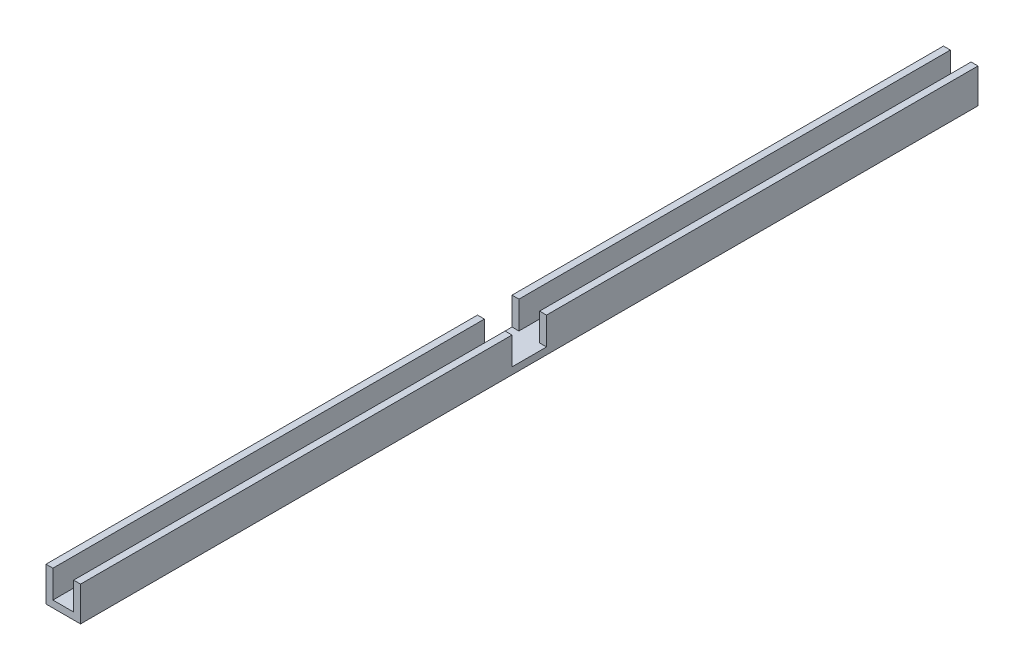
ISO-10303-21;
HEADER;
FILE_DESCRIPTION(('STEP AP214'),'2;1');
FILE_NAME('part.step','',(''),(''),'','','');
FILE_SCHEMA(('AUTOMOTIVE_DESIGN { 1 0 10303 214 1 1 1 1 }'));
ENDSEC;
DATA;
#1=APPLICATION_CONTEXT('core data for automotive mechanical design processes');
#2=APPLICATION_PROTOCOL_DEFINITION('international standard','automotive_design',2000,#1);
#3=PRODUCT_CONTEXT('',#1,'mechanical');
#4=PRODUCT('Part','Part','',(#3));
#5=PRODUCT_RELATED_PRODUCT_CATEGORY('part','',(#4));
#6=PRODUCT_DEFINITION_FORMATION('','',#4);
#7=PRODUCT_DEFINITION_CONTEXT('part definition',#1,'design');
#8=PRODUCT_DEFINITION('design','',#6,#7);
#9=PRODUCT_DEFINITION_SHAPE('','',#8);
#10=(LENGTH_UNIT() NAMED_UNIT(*) SI_UNIT(.MILLI.,.METRE.));
#11=(NAMED_UNIT(*) PLANE_ANGLE_UNIT() SI_UNIT($,.RADIAN.));
#12=(NAMED_UNIT(*) SI_UNIT($,.STERADIAN.) SOLID_ANGLE_UNIT());
#13=UNCERTAINTY_MEASURE_WITH_UNIT(LENGTH_MEASURE(1.E-05),#10,'distance_accuracy_value','');
#14=(GEOMETRIC_REPRESENTATION_CONTEXT(3) GLOBAL_UNCERTAINTY_ASSIGNED_CONTEXT((#13)) GLOBAL_UNIT_ASSIGNED_CONTEXT((#10,
#11,#12)) REPRESENTATION_CONTEXT('',''));
#15=CARTESIAN_POINT('',(0.,0.,0.));
#16=DIRECTION('',(0.,0.,1.));
#17=DIRECTION('',(1.,0.,0.));
#18=AXIS2_PLACEMENT_3D('',#15,#16,#17);
#19=CARTESIAN_POINT('',(2.,0.,260.));
#20=DIRECTION('',(0.,-1.,0.));
#21=DIRECTION('',(1.,0.,0.));
#22=AXIS2_PLACEMENT_3D('',#19,#20,#21);
#23=PLANE('',#22);
#24=DIRECTION('',(0.,0.,-1.));
#25=VECTOR('',#24,1.);
#26=CARTESIAN_POINT('',(0.,0.,260.));
#27=LINE('',#26,#25);
#28=CARTESIAN_POINT('',(0.,0.,125.));
#29=VERTEX_POINT('',#28);
#30=CARTESIAN_POINT('',(0.,0.,0.));
#31=VERTEX_POINT('',#30);
#32=EDGE_CURVE('E169',#29,#31,#27,.T.);
#33=ORIENTED_EDGE('',*,*,#32,.F.);
#34=DIRECTION('',(-1.,0.,0.));
#35=VECTOR('',#34,1.);
#36=CARTESIAN_POINT('',(-8.99622604747202,0.,125.));
#37=LINE('',#36,#35);
#38=CARTESIAN_POINT('',(2.,0.,125.));
#39=VERTEX_POINT('',#38);
#40=EDGE_CURVE('E162',#39,#29,#37,.T.);
#41=ORIENTED_EDGE('',*,*,#40,.F.);
#42=DIRECTION('',(0.,0.,-1.));
#43=VECTOR('',#42,1.);
#44=CARTESIAN_POINT('',(2.,0.,260.));
#45=LINE('',#44,#43);
#46=CARTESIAN_POINT('',(2.,0.,0.));
#47=VERTEX_POINT('',#46);
#48=EDGE_CURVE('E195',#39,#47,#45,.T.);
#49=ORIENTED_EDGE('',*,*,#48,.T.);
#50=DIRECTION('',(-1.,0.,0.));
#51=VECTOR('',#50,1.);
#52=CARTESIAN_POINT('',(2.,0.,0.));
#53=LINE('',#52,#51);
#54=EDGE_CURVE('E216',#47,#31,#53,.T.);
#55=ORIENTED_EDGE('',*,*,#54,.T.);
#56=EDGE_LOOP('',(#33,#41,#49,#55));
#57=FACE_BOUND('',#56,.T.);
#58=ADVANCED_FACE('F32',(#57),#23,.F.);
#59=CARTESIAN_POINT('',(10.,0.,260.));
#60=DIRECTION('',(0.,-1.,0.));
#61=DIRECTION('',(1.,0.,0.));
#62=AXIS2_PLACEMENT_3D('',#59,#60,#61);
#63=PLANE('',#62);
#64=DIRECTION('',(0.,0.,-1.));
#65=VECTOR('',#64,1.);
#66=CARTESIAN_POINT('',(8.,0.,260.));
#67=LINE('',#66,#65);
#68=CARTESIAN_POINT('',(8.,0.,125.));
#69=VERTEX_POINT('',#68);
#70=CARTESIAN_POINT('',(8.,0.,0.));
#71=VERTEX_POINT('',#70);
#72=EDGE_CURVE('E185',#69,#71,#67,.T.);
#73=ORIENTED_EDGE('',*,*,#72,.F.);
#74=CARTESIAN_POINT('',(10.,0.,125.));
#75=VERTEX_POINT('',#74);
#76=EDGE_CURVE('E250',#75,#69,#37,.T.);
#77=ORIENTED_EDGE('',*,*,#76,.F.);
#78=DIRECTION('',(0.,0.,-1.));
#79=VECTOR('',#78,1.);
#80=CARTESIAN_POINT('',(10.,0.,260.));
#81=LINE('',#80,#79);
#82=CARTESIAN_POINT('',(10.,0.,0.));
#83=VERTEX_POINT('',#82);
#84=EDGE_CURVE('E181',#75,#83,#81,.T.);
#85=ORIENTED_EDGE('',*,*,#84,.T.);
#86=DIRECTION('',(-1.,0.,0.));
#87=VECTOR('',#86,1.);
#88=CARTESIAN_POINT('',(10.,0.,0.));
#89=LINE('',#88,#87);
#90=EDGE_CURVE('E206',#83,#71,#89,.T.);
#91=ORIENTED_EDGE('',*,*,#90,.T.);
#92=EDGE_LOOP('',(#73,#77,#85,#91));
#93=FACE_BOUND('',#92,.T.);
#94=ADVANCED_FACE('F267',(#93),#63,.F.);
#95=CARTESIAN_POINT('',(8.,0.,260.));
#96=DIRECTION('',(1.,0.,0.));
#97=DIRECTION('',(0.,1.,0.));
#98=AXIS2_PLACEMENT_3D('',#95,#96,#97);
#99=PLANE('',#98);
#100=DIRECTION('',(0.,0.,-1.));
#101=VECTOR('',#100,1.);
#102=CARTESIAN_POINT('',(8.,-8.,260.));
#103=LINE('',#102,#101);
#104=CARTESIAN_POINT('',(8.,-8.,125.));
#105=VERTEX_POINT('',#104);
#106=CARTESIAN_POINT('',(8.,-8.,0.));
#107=VERTEX_POINT('',#106);
#108=EDGE_CURVE('E189',#105,#107,#103,.T.);
#109=ORIENTED_EDGE('',*,*,#108,.F.);
#110=DIRECTION('',(0.,1.,0.));
#111=VECTOR('',#110,1.);
#112=CARTESIAN_POINT('',(8.,0.,125.));
#113=LINE('',#112,#111);
#114=EDGE_CURVE('E152',#105,#69,#113,.T.);
#115=ORIENTED_EDGE('',*,*,#114,.T.);
#116=ORIENTED_EDGE('',*,*,#72,.T.);
#117=DIRECTION('',(0.,-1.,0.));
#118=VECTOR('',#117,1.);
#119=CARTESIAN_POINT('',(8.,0.,0.));
#120=LINE('',#119,#118);
#121=EDGE_CURVE('E203',#71,#107,#120,.T.);
#122=ORIENTED_EDGE('',*,*,#121,.T.);
#123=EDGE_LOOP('',(#109,#115,#116,#122));
#124=FACE_BOUND('',#123,.T.);
#125=ADVANCED_FACE('F266',(#124),#99,.F.);
#126=CARTESIAN_POINT('',(2.,-8.,260.));
#127=DIRECTION('',(-1.,0.,0.));
#128=DIRECTION('',(0.,0.,1.));
#129=AXIS2_PLACEMENT_3D('',#126,#127,#128);
#130=PLANE('',#129);
#131=ORIENTED_EDGE('',*,*,#48,.F.);
#132=DIRECTION('',(0.,-1.,0.));
#133=VECTOR('',#132,1.);
#134=CARTESIAN_POINT('',(2.,-8.,125.));
#135=LINE('',#134,#133);
#136=CARTESIAN_POINT('',(2.,-8.,125.));
#137=VERTEX_POINT('',#136);
#138=EDGE_CURVE('E11',#39,#137,#135,.T.);
#139=ORIENTED_EDGE('',*,*,#138,.T.);
#140=DIRECTION('',(0.,0.,-1.));
#141=VECTOR('',#140,1.);
#142=CARTESIAN_POINT('',(2.,-8.,260.));
#143=LINE('',#142,#141);
#144=CARTESIAN_POINT('',(2.,-8.,0.));
#145=VERTEX_POINT('',#144);
#146=EDGE_CURVE('E193',#137,#145,#143,.T.);
#147=ORIENTED_EDGE('',*,*,#146,.T.);
#148=DIRECTION('',(0.,1.,0.));
#149=VECTOR('',#148,1.);
#150=CARTESIAN_POINT('',(2.,-8.,0.));
#151=LINE('',#150,#149);
#152=EDGE_CURVE('E196',#145,#47,#151,.T.);
#153=ORIENTED_EDGE('',*,*,#152,.T.);
#154=EDGE_LOOP('',(#131,#139,#147,#153));
#155=FACE_BOUND('',#154,.T.);
#156=ADVANCED_FACE('F280',(#155),#130,.F.);
#157=CARTESIAN_POINT('',(2.,0.,260.));
#158=VERTEX_POINT('',#157);
#159=CARTESIAN_POINT('',(2.,0.,135.));
#160=VERTEX_POINT('',#159);
#161=EDGE_CURVE('E161',#158,#160,#45,.T.);
#162=ORIENTED_EDGE('',*,*,#161,.T.);
#163=DIRECTION('',(1.,0.,0.));
#164=VECTOR('',#163,1.);
#165=CARTESIAN_POINT('',(-8.99622604747202,0.,135.));
#166=LINE('',#165,#164);
#167=CARTESIAN_POINT('',(0.,0.,135.));
#168=VERTEX_POINT('',#167);
#169=EDGE_CURVE('E147',#168,#160,#166,.T.);
#170=ORIENTED_EDGE('',*,*,#169,.F.);
#171=CARTESIAN_POINT('',(0.,0.,260.));
#172=VERTEX_POINT('',#171);
#173=EDGE_CURVE('E159',#172,#168,#27,.T.);
#174=ORIENTED_EDGE('',*,*,#173,.F.);
#175=DIRECTION('',(-1.,0.,0.));
#176=VECTOR('',#175,1.);
#177=CARTESIAN_POINT('',(2.,0.,260.));
#178=LINE('',#177,#176);
#179=EDGE_CURVE('E199',#158,#172,#178,.T.);
#180=ORIENTED_EDGE('',*,*,#179,.F.);
#181=EDGE_LOOP('',(#162,#170,#174,#180));
#182=FACE_BOUND('',#181,.T.);
#183=ADVANCED_FACE('F34',(#182),#23,.F.);
#184=CARTESIAN_POINT('',(0.,0.,260.));
#185=DIRECTION('',(1.,0.,0.));
#186=DIRECTION('',(0.,1.,0.));
#187=AXIS2_PLACEMENT_3D('',#184,#185,#186);
#188=PLANE('',#187);
#189=DIRECTION('',(0.,0.,1.));
#190=VECTOR('',#189,1.);
#191=CARTESIAN_POINT('',(0.,-8.,260.));
#192=LINE('',#191,#190);
#193=CARTESIAN_POINT('',(0.,-8.,125.));
#194=VERTEX_POINT('',#193);
#195=CARTESIAN_POINT('',(0.,-8.,135.));
#196=VERTEX_POINT('',#195);
#197=EDGE_CURVE('E246',#194,#196,#192,.T.);
#198=ORIENTED_EDGE('',*,*,#197,.F.);
#199=DIRECTION('',(0.,1.,0.));
#200=VECTOR('',#199,1.);
#201=CARTESIAN_POINT('',(0.,0.,125.));
#202=LINE('',#201,#200);
#203=EDGE_CURVE('E219',#194,#29,#202,.T.);
#204=ORIENTED_EDGE('',*,*,#203,.T.);
#205=ORIENTED_EDGE('',*,*,#32,.T.);
#206=DIRECTION('',(0.,-1.,0.));
#207=VECTOR('',#206,1.);
#208=CARTESIAN_POINT('',(0.,0.,0.));
#209=LINE('',#208,#207);
#210=CARTESIAN_POINT('',(0.,-10.,0.));
#211=VERTEX_POINT('',#210);
#212=EDGE_CURVE('E214',#31,#211,#209,.T.);
#213=ORIENTED_EDGE('',*,*,#212,.T.);
#214=DIRECTION('',(0.,0.,-1.));
#215=VECTOR('',#214,1.);
#216=CARTESIAN_POINT('',(0.,-10.,260.));
#217=LINE('',#216,#215);
#218=CARTESIAN_POINT('',(0.,-10.,260.));
#219=VERTEX_POINT('',#218);
#220=EDGE_CURVE('E171',#219,#211,#217,.T.);
#221=ORIENTED_EDGE('',*,*,#220,.F.);
#222=DIRECTION('',(0.,-1.,0.));
#223=VECTOR('',#222,1.);
#224=CARTESIAN_POINT('',(0.,0.,260.));
#225=LINE('',#224,#223);
#226=EDGE_CURVE('E167',#172,#219,#225,.T.);
#227=ORIENTED_EDGE('',*,*,#226,.F.);
#228=ORIENTED_EDGE('',*,*,#173,.T.);
#229=DIRECTION('',(0.,-1.,0.));
#230=VECTOR('',#229,1.);
#231=CARTESIAN_POINT('',(0.,0.,135.));
#232=LINE('',#231,#230);
#233=EDGE_CURVE('E144',#168,#196,#232,.T.);
#234=ORIENTED_EDGE('',*,*,#233,.T.);
#235=EDGE_LOOP('',(#198,#204,#205,#213,#221,#227,#228,#234));
#236=FACE_BOUND('',#235,.T.);
#237=ADVANCED_FACE('F165',(#236),#188,.F.);
#238=CARTESIAN_POINT('',(0.,-10.,260.));
#239=DIRECTION('',(0.,1.,0.));
#240=DIRECTION('',(0.,0.,1.));
#241=AXIS2_PLACEMENT_3D('',#238,#239,#240);
#242=PLANE('',#241);
#243=DIRECTION('',(1.,0.,0.));
#244=VECTOR('',#243,1.);
#245=CARTESIAN_POINT('',(0.,-10.,0.));
#246=LINE('',#245,#244);
#247=CARTESIAN_POINT('',(10.,-10.,0.));
#248=VERTEX_POINT('',#247);
#249=EDGE_CURVE('E212',#211,#248,#246,.T.);
#250=ORIENTED_EDGE('',*,*,#249,.T.);
#251=DIRECTION('',(0.,0.,-1.));
#252=VECTOR('',#251,1.);
#253=CARTESIAN_POINT('',(10.,-10.,260.));
#254=LINE('',#253,#252);
#255=CARTESIAN_POINT('',(10.,-10.,260.));
#256=VERTEX_POINT('',#255);
#257=EDGE_CURVE('E175',#256,#248,#254,.T.);
#258=ORIENTED_EDGE('',*,*,#257,.F.);
#259=DIRECTION('',(1.,0.,0.));
#260=VECTOR('',#259,1.);
#261=CARTESIAN_POINT('',(0.,-10.,260.));
#262=LINE('',#261,#260);
#263=EDGE_CURVE('E230',#219,#256,#262,.T.);
#264=ORIENTED_EDGE('',*,*,#263,.F.);
#265=ORIENTED_EDGE('',*,*,#220,.T.);
#266=EDGE_LOOP('',(#250,#258,#264,#265));
#267=FACE_BOUND('',#266,.T.);
#268=ADVANCED_FACE('F290',(#267),#242,.F.);
#269=CARTESIAN_POINT('',(10.,-10.,260.));
#270=DIRECTION('',(-1.,0.,0.));
#271=DIRECTION('',(0.,0.,1.));
#272=AXIS2_PLACEMENT_3D('',#269,#270,#271);
#273=PLANE('',#272);
#274=ORIENTED_EDGE('',*,*,#84,.F.);
#275=DIRECTION('',(0.,-1.,0.));
#276=VECTOR('',#275,1.);
#277=CARTESIAN_POINT('',(10.,-10.,125.));
#278=LINE('',#277,#276);
#279=CARTESIAN_POINT('',(10.,-8.,125.));
#280=VERTEX_POINT('',#279);
#281=EDGE_CURVE('E236',#75,#280,#278,.T.);
#282=ORIENTED_EDGE('',*,*,#281,.T.);
#283=DIRECTION('',(0.,0.,-1.));
#284=VECTOR('',#283,1.);
#285=CARTESIAN_POINT('',(10.,-8.,260.));
#286=LINE('',#285,#284);
#287=CARTESIAN_POINT('',(10.,-8.,135.));
#288=VERTEX_POINT('',#287);
#289=EDGE_CURVE('E248',#288,#280,#286,.T.);
#290=ORIENTED_EDGE('',*,*,#289,.F.);
#291=DIRECTION('',(0.,1.,0.));
#292=VECTOR('',#291,1.);
#293=CARTESIAN_POINT('',(10.,-10.,135.));
#294=LINE('',#293,#292);
#295=CARTESIAN_POINT('',(10.,0.,135.));
#296=VERTEX_POINT('',#295);
#297=EDGE_CURVE('E153',#288,#296,#294,.T.);
#298=ORIENTED_EDGE('',*,*,#297,.T.);
#299=CARTESIAN_POINT('',(10.,0.,260.));
#300=VERTEX_POINT('',#299);
#301=EDGE_CURVE('E178',#300,#296,#81,.T.);
#302=ORIENTED_EDGE('',*,*,#301,.F.);
#303=DIRECTION('',(0.,1.,0.));
#304=VECTOR('',#303,1.);
#305=CARTESIAN_POINT('',(10.,-10.,260.));
#306=LINE('',#305,#304);
#307=EDGE_CURVE('E228',#256,#300,#306,.T.);
#308=ORIENTED_EDGE('',*,*,#307,.F.);
#309=ORIENTED_EDGE('',*,*,#257,.T.);
#310=DIRECTION('',(0.,1.,0.));
#311=VECTOR('',#310,1.);
#312=CARTESIAN_POINT('',(10.,-10.,0.));
#313=LINE('',#312,#311);
#314=EDGE_CURVE('E209',#248,#83,#313,.T.);
#315=ORIENTED_EDGE('',*,*,#314,.T.);
#316=EDGE_LOOP('',(#274,#282,#290,#298,#302,#308,#309,#315));
#317=FACE_BOUND('',#316,.T.);
#318=ADVANCED_FACE('F294',(#317),#273,.F.);
#319=ORIENTED_EDGE('',*,*,#301,.T.);
#320=CARTESIAN_POINT('',(8.,0.,135.));
#321=VERTEX_POINT('',#320);
#322=EDGE_CURVE('E163',#321,#296,#166,.T.);
#323=ORIENTED_EDGE('',*,*,#322,.F.);
#324=CARTESIAN_POINT('',(8.,0.,260.));
#325=VERTEX_POINT('',#324);
#326=EDGE_CURVE('E182',#325,#321,#67,.T.);
#327=ORIENTED_EDGE('',*,*,#326,.F.);
#328=DIRECTION('',(-1.,0.,0.));
#329=VECTOR('',#328,1.);
#330=CARTESIAN_POINT('',(10.,0.,260.));
#331=LINE('',#330,#329);
#332=EDGE_CURVE('E226',#300,#325,#331,.T.);
#333=ORIENTED_EDGE('',*,*,#332,.F.);
#334=EDGE_LOOP('',(#319,#323,#327,#333));
#335=FACE_BOUND('',#334,.T.);
#336=ADVANCED_FACE('F312',(#335),#63,.F.);
#337=ORIENTED_EDGE('',*,*,#326,.T.);
#338=DIRECTION('',(0.,-1.,0.));
#339=VECTOR('',#338,1.);
#340=CARTESIAN_POINT('',(8.,0.,135.));
#341=LINE('',#340,#339);
#342=CARTESIAN_POINT('',(8.,-8.,135.));
#343=VERTEX_POINT('',#342);
#344=EDGE_CURVE('E243',#321,#343,#341,.T.);
#345=ORIENTED_EDGE('',*,*,#344,.T.);
#346=CARTESIAN_POINT('',(8.,-8.,260.));
#347=VERTEX_POINT('',#346);
#348=EDGE_CURVE('E186',#347,#343,#103,.T.);
#349=ORIENTED_EDGE('',*,*,#348,.F.);
#350=DIRECTION('',(0.,-1.,0.));
#351=VECTOR('',#350,1.);
#352=CARTESIAN_POINT('',(8.,0.,260.));
#353=LINE('',#352,#351);
#354=EDGE_CURVE('E224',#325,#347,#353,.T.);
#355=ORIENTED_EDGE('',*,*,#354,.F.);
#356=EDGE_LOOP('',(#337,#345,#349,#355));
#357=FACE_BOUND('',#356,.T.);
#358=ADVANCED_FACE('F307',(#357),#99,.F.);
#359=CARTESIAN_POINT('',(8.,-8.,260.));
#360=DIRECTION('',(0.,-1.,0.));
#361=DIRECTION('',(0.,0.,-1.));
#362=AXIS2_PLACEMENT_3D('',#359,#360,#361);
#363=PLANE('',#362);
#364=ORIENTED_EDGE('',*,*,#348,.T.);
#365=DIRECTION('',(1.,0.,0.));
#366=VECTOR('',#365,1.);
#367=CARTESIAN_POINT('',(-8.99622604747202,-8.,135.));
#368=LINE('',#367,#366);
#369=EDGE_CURVE('E255',#343,#288,#368,.T.);
#370=ORIENTED_EDGE('',*,*,#369,.T.);
#371=ORIENTED_EDGE('',*,*,#289,.T.);
#372=DIRECTION('',(-1.,0.,0.));
#373=VECTOR('',#372,1.);
#374=CARTESIAN_POINT('',(-8.99622604747202,-8.,125.));
#375=LINE('',#374,#373);
#376=EDGE_CURVE('E47',#280,#105,#375,.T.);
#377=ORIENTED_EDGE('',*,*,#376,.T.);
#378=ORIENTED_EDGE('',*,*,#108,.T.);
#379=DIRECTION('',(-1.,0.,0.));
#380=VECTOR('',#379,1.);
#381=CARTESIAN_POINT('',(8.,-8.,0.));
#382=LINE('',#381,#380);
#383=EDGE_CURVE('E200',#107,#145,#382,.T.);
#384=ORIENTED_EDGE('',*,*,#383,.T.);
#385=ORIENTED_EDGE('',*,*,#146,.F.);
#386=EDGE_CURVE('E252',#137,#194,#375,.T.);
#387=ORIENTED_EDGE('',*,*,#386,.T.);
#388=ORIENTED_EDGE('',*,*,#197,.T.);
#389=CARTESIAN_POINT('',(2.,-8.,135.));
#390=VERTEX_POINT('',#389);
#391=EDGE_CURVE('E54',#196,#390,#368,.T.);
#392=ORIENTED_EDGE('',*,*,#391,.T.);
#393=CARTESIAN_POINT('',(2.,-8.,260.));
#394=VERTEX_POINT('',#393);
#395=EDGE_CURVE('E190',#394,#390,#143,.T.);
#396=ORIENTED_EDGE('',*,*,#395,.F.);
#397=DIRECTION('',(-1.,0.,0.));
#398=VECTOR('',#397,1.);
#399=CARTESIAN_POINT('',(8.,-8.,260.));
#400=LINE('',#399,#398);
#401=EDGE_CURVE('E222',#347,#394,#400,.T.);
#402=ORIENTED_EDGE('',*,*,#401,.F.);
#403=EDGE_LOOP('',(#364,#370,#371,#377,#378,#384,#385,#387,#388,#392,#396,#402));
#404=FACE_BOUND('',#403,.T.);
#405=ADVANCED_FACE('F277',(#404),#363,.F.);
#406=ORIENTED_EDGE('',*,*,#395,.T.);
#407=DIRECTION('',(0.,1.,0.));
#408=VECTOR('',#407,1.);
#409=CARTESIAN_POINT('',(2.,-8.,135.));
#410=LINE('',#409,#408);
#411=EDGE_CURVE('E40',#390,#160,#410,.T.);
#412=ORIENTED_EDGE('',*,*,#411,.T.);
#413=ORIENTED_EDGE('',*,*,#161,.F.);
#414=DIRECTION('',(0.,1.,0.));
#415=VECTOR('',#414,1.);
#416=CARTESIAN_POINT('',(2.,-8.,260.));
#417=LINE('',#416,#415);
#418=EDGE_CURVE('E220',#394,#158,#417,.T.);
#419=ORIENTED_EDGE('',*,*,#418,.F.);
#420=EDGE_LOOP('',(#406,#412,#413,#419));
#421=FACE_BOUND('',#420,.T.);
#422=ADVANCED_FACE('F303',(#421),#130,.F.);
#423=CARTESIAN_POINT('',(0.,0.,260.));
#424=DIRECTION('',(0.,0.,1.));
#425=DIRECTION('',(1.,0.,0.));
#426=AXIS2_PLACEMENT_3D('',#423,#424,#425);
#427=PLANE('',#426);
#428=ORIENTED_EDGE('',*,*,#179,.T.);
#429=ORIENTED_EDGE('',*,*,#226,.T.);
#430=ORIENTED_EDGE('',*,*,#263,.T.);
#431=ORIENTED_EDGE('',*,*,#307,.T.);
#432=ORIENTED_EDGE('',*,*,#332,.T.);
#433=ORIENTED_EDGE('',*,*,#354,.T.);
#434=ORIENTED_EDGE('',*,*,#401,.T.);
#435=ORIENTED_EDGE('',*,*,#418,.T.);
#436=EDGE_LOOP('',(#428,#429,#430,#431,#432,#433,#434,#435));
#437=FACE_BOUND('',#436,.T.);
#438=ADVANCED_FACE('F298',(#437),#427,.T.);
#439=CARTESIAN_POINT('',(0.,0.,0.));
#440=DIRECTION('',(0.,0.,1.));
#441=DIRECTION('',(1.,0.,0.));
#442=AXIS2_PLACEMENT_3D('',#439,#440,#441);
#443=PLANE('',#442);
#444=ORIENTED_EDGE('',*,*,#54,.F.);
#445=ORIENTED_EDGE('',*,*,#152,.F.);
#446=ORIENTED_EDGE('',*,*,#383,.F.);
#447=ORIENTED_EDGE('',*,*,#121,.F.);
#448=ORIENTED_EDGE('',*,*,#90,.F.);
#449=ORIENTED_EDGE('',*,*,#314,.F.);
#450=ORIENTED_EDGE('',*,*,#249,.F.);
#451=ORIENTED_EDGE('',*,*,#212,.F.);
#452=EDGE_LOOP('',(#444,#445,#446,#447,#448,#449,#450,#451));
#453=FACE_BOUND('',#452,.T.);
#454=ADVANCED_FACE('F274',(#453),#443,.F.);
#455=CARTESIAN_POINT('',(-8.99622604747202,-8.,135.));
#456=DIRECTION('',(0.,0.,1.));
#457=DIRECTION('',(1.,0.,0.));
#458=AXIS2_PLACEMENT_3D('',#455,#456,#457);
#459=PLANE('',#458);
#460=ORIENTED_EDGE('',*,*,#169,.T.);
#461=ORIENTED_EDGE('',*,*,#411,.F.);
#462=ORIENTED_EDGE('',*,*,#391,.F.);
#463=ORIENTED_EDGE('',*,*,#233,.F.);
#464=EDGE_LOOP('',(#460,#461,#462,#463));
#465=FACE_BOUND('',#464,.T.);
#466=ADVANCED_FACE('F146',(#465),#459,.F.);
#467=CARTESIAN_POINT('',(-8.99622604747202,-8.,125.));
#468=DIRECTION('',(0.,0.,-1.));
#469=DIRECTION('',(-1.,0.,0.));
#470=AXIS2_PLACEMENT_3D('',#467,#468,#469);
#471=PLANE('',#470);
#472=ORIENTED_EDGE('',*,*,#386,.F.);
#473=ORIENTED_EDGE('',*,*,#138,.F.);
#474=ORIENTED_EDGE('',*,*,#40,.T.);
#475=ORIENTED_EDGE('',*,*,#203,.F.);
#476=EDGE_LOOP('',(#472,#473,#474,#475));
#477=FACE_BOUND('',#476,.T.);
#478=ADVANCED_FACE('F283',(#477),#471,.F.);
#479=ORIENTED_EDGE('',*,*,#76,.T.);
#480=ORIENTED_EDGE('',*,*,#114,.F.);
#481=ORIENTED_EDGE('',*,*,#376,.F.);
#482=ORIENTED_EDGE('',*,*,#281,.F.);
#483=EDGE_LOOP('',(#479,#480,#481,#482));
#484=FACE_BOUND('',#483,.T.);
#485=ADVANCED_FACE('F260',(#484),#471,.F.);
#486=ORIENTED_EDGE('',*,*,#369,.F.);
#487=ORIENTED_EDGE('',*,*,#344,.F.);
#488=ORIENTED_EDGE('',*,*,#322,.T.);
#489=ORIENTED_EDGE('',*,*,#297,.F.);
#490=EDGE_LOOP('',(#486,#487,#488,#489));
#491=FACE_BOUND('',#490,.T.);
#492=ADVANCED_FACE('F310',(#491),#459,.F.);
#493=CLOSED_SHELL('',(#58,#94,#125,#156,#183,#237,#268,#318,#336,#358,#405,#422,#438,#454,#466,
#478,#485,#492));
#494=MANIFOLD_SOLID_BREP('B2',#493);
#495=ADVANCED_BREP_SHAPE_REPRESENTATION('',(#18,#494),#14);
#496=SHAPE_DEFINITION_REPRESENTATION(#9,#495);
ENDSEC;
END-ISO-10303-21;
